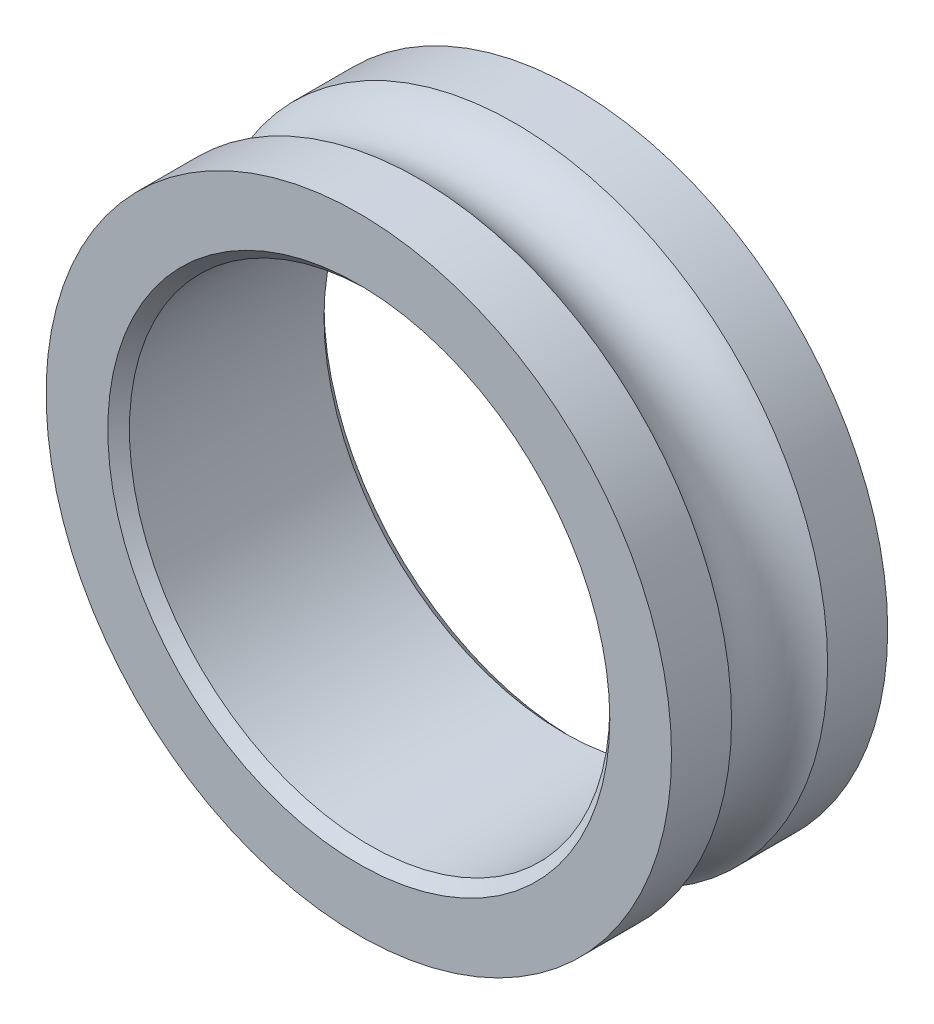
ISO-10303-21;
HEADER;
FILE_DESCRIPTION(('STEP AP214'),'2;1');
FILE_NAME('part.step','',(''),(''),'','','');
FILE_SCHEMA(('AUTOMOTIVE_DESIGN { 1 0 10303 214 1 1 1 1 }'));
ENDSEC;
DATA;
#1=APPLICATION_CONTEXT('core data for automotive mechanical design processes');
#2=APPLICATION_PROTOCOL_DEFINITION('international standard','automotive_design',2000,#1);
#3=PRODUCT_CONTEXT('',#1,'mechanical');
#4=PRODUCT('Part','Part','',(#3));
#5=PRODUCT_RELATED_PRODUCT_CATEGORY('part','',(#4));
#6=PRODUCT_DEFINITION_FORMATION('','',#4);
#7=PRODUCT_DEFINITION_CONTEXT('part definition',#1,'design');
#8=PRODUCT_DEFINITION('design','',#6,#7);
#9=PRODUCT_DEFINITION_SHAPE('','',#8);
#10=(LENGTH_UNIT() NAMED_UNIT(*) SI_UNIT(.MILLI.,.METRE.));
#11=(NAMED_UNIT(*) PLANE_ANGLE_UNIT() SI_UNIT($,.RADIAN.));
#12=(NAMED_UNIT(*) SI_UNIT($,.STERADIAN.) SOLID_ANGLE_UNIT());
#13=UNCERTAINTY_MEASURE_WITH_UNIT(LENGTH_MEASURE(1.E-05),#10,'distance_accuracy_value','');
#14=(GEOMETRIC_REPRESENTATION_CONTEXT(3) GLOBAL_UNCERTAINTY_ASSIGNED_CONTEXT((#13)) GLOBAL_UNIT_ASSIGNED_CONTEXT((#10,
#11,#12)) REPRESENTATION_CONTEXT('',''));
#15=CARTESIAN_POINT('',(0.,0.,0.));
#16=DIRECTION('',(0.,0.,1.));
#17=DIRECTION('',(1.,0.,0.));
#18=AXIS2_PLACEMENT_3D('',#15,#16,#17);
#19=CARTESIAN_POINT('',(0.,10.45,-4.5));
#20=DIRECTION('',(0.,0.,1.));
#21=DIRECTION('',(1.,0.,0.));
#22=AXIS2_PLACEMENT_3D('',#19,#20,#21);
#23=PLANE('',#22);
#24=CARTESIAN_POINT('',(0.,0.,-4.5));
#25=DIRECTION('',(0.,0.,1.));
#26=DIRECTION('',(-1.,0.,0.));
#27=AXIS2_PLACEMENT_3D('',#24,#25,#26);
#28=CIRCLE('',#27,10.45);
#29=CARTESIAN_POINT('',(-10.45,0.,-4.5));
#30=VERTEX_POINT('',#29);
#31=EDGE_CURVE('E39',#30,#30,#28,.T.);
#32=ORIENTED_EDGE('',*,*,#31,.T.);
#33=EDGE_LOOP('',(#32));
#34=FACE_BOUND('',#33,.T.);
#35=CARTESIAN_POINT('',(0.,0.,-4.5));
#36=DIRECTION('',(0.,0.,1.));
#37=DIRECTION('',(1.,0.,0.));
#38=AXIS2_PLACEMENT_3D('',#35,#36,#37);
#39=CIRCLE('',#38,13.0192307692308);
#40=CARTESIAN_POINT('',(13.0192307692308,0.,-4.5));
#41=VERTEX_POINT('',#40);
#42=EDGE_CURVE('E23',#41,#41,#39,.T.);
#43=ORIENTED_EDGE('',*,*,#42,.F.);
#44=EDGE_LOOP('',(#43));
#45=FACE_BOUND('',#44,.T.);
#46=ADVANCED_FACE('F15',(#34,#45),#23,.F.);
#47=CARTESIAN_POINT('',(0.,13.0192307692308,4.5));
#48=DIRECTION('',(0.,0.,-1.));
#49=DIRECTION('',(0.,-1.,0.));
#50=AXIS2_PLACEMENT_3D('',#47,#48,#49);
#51=PLANE('',#50);
#52=CARTESIAN_POINT('',(0.,0.,4.5));
#53=DIRECTION('',(0.,0.,-1.));
#54=DIRECTION('',(1.,0.,0.));
#55=AXIS2_PLACEMENT_3D('',#52,#53,#54);
#56=CIRCLE('',#55,10.45);
#57=CARTESIAN_POINT('',(10.45,0.,4.5));
#58=VERTEX_POINT('',#57);
#59=EDGE_CURVE('E32',#58,#58,#56,.T.);
#60=ORIENTED_EDGE('',*,*,#59,.T.);
#61=EDGE_LOOP('',(#60));
#62=FACE_BOUND('',#61,.T.);
#63=CARTESIAN_POINT('',(0.,0.,4.5));
#64=DIRECTION('',(0.,0.,-1.));
#65=DIRECTION('',(1.,0.,0.));
#66=AXIS2_PLACEMENT_3D('',#63,#64,#65);
#67=CIRCLE('',#66,13.0192307692308);
#68=CARTESIAN_POINT('',(13.0192307692308,0.,4.5));
#69=VERTEX_POINT('',#68);
#70=EDGE_CURVE('E10',#69,#69,#67,.T.);
#71=ORIENTED_EDGE('',*,*,#70,.F.);
#72=EDGE_LOOP('',(#71));
#73=FACE_BOUND('',#72,.T.);
#74=ADVANCED_FACE('F83',(#62,#73),#51,.F.);
#75=CARTESIAN_POINT('',(0.,0.,4.5));
#76=DIRECTION('',(0.,0.,1.));
#77=DIRECTION('',(1.,0.,0.));
#78=AXIS2_PLACEMENT_3D('',#75,#76,#77);
#79=CYLINDRICAL_SURFACE('',#78,13.0192307692308);
#80=ORIENTED_EDGE('',*,*,#70,.T.);
#81=EDGE_LOOP('',(#80));
#82=FACE_BOUND('',#81,.T.);
#83=CARTESIAN_POINT('',(0.,0.,2.));
#84=DIRECTION('',(0.,0.,1.));
#85=DIRECTION('',(1.,0.,0.));
#86=AXIS2_PLACEMENT_3D('',#83,#84,#85);
#87=CIRCLE('',#86,13.0192307692308);
#88=CARTESIAN_POINT('',(13.0192307692308,0.,2.));
#89=VERTEX_POINT('',#88);
#90=EDGE_CURVE('E49',#89,#89,#87,.T.);
#91=ORIENTED_EDGE('',*,*,#90,.T.);
#92=EDGE_LOOP('',(#91));
#93=FACE_BOUND('',#92,.T.);
#94=ADVANCED_FACE('F17',(#82,#93),#79,.T.);
#95=CARTESIAN_POINT('',(0.,0.,4.5));
#96=DIRECTION('',(0.,0.,1.));
#97=DIRECTION('',(1.,0.,0.));
#98=AXIS2_PLACEMENT_3D('',#95,#96,#97);
#99=CYLINDRICAL_SURFACE('',#98,13.0192307692308);
#100=CARTESIAN_POINT('',(0.,0.,-2.));
#101=DIRECTION('',(0.,0.,-1.));
#102=DIRECTION('',(1.,0.,0.));
#103=AXIS2_PLACEMENT_3D('',#100,#101,#102);
#104=CIRCLE('',#103,13.0192307692308);
#105=CARTESIAN_POINT('',(13.0192307692308,0.,-2.));
#106=VERTEX_POINT('',#105);
#107=EDGE_CURVE('E53',#106,#106,#104,.T.);
#108=ORIENTED_EDGE('',*,*,#107,.T.);
#109=EDGE_LOOP('',(#108));
#110=FACE_BOUND('',#109,.T.);
#111=ORIENTED_EDGE('',*,*,#42,.T.);
#112=EDGE_LOOP('',(#111));
#113=FACE_BOUND('',#112,.T.);
#114=ADVANCED_FACE('F92',(#110,#113),#99,.T.);
#115=CARTESIAN_POINT('',(0.,0.,4.5));
#116=DIRECTION('',(0.,0.,1.));
#117=DIRECTION('',(1.,0.,0.));
#118=AXIS2_PLACEMENT_3D('',#115,#116,#117);
#119=CONICAL_SURFACE('',#118,10.45,0.785398163397453);
#120=ORIENTED_EDGE('',*,*,#59,.F.);
#121=EDGE_LOOP('',(#120));
#122=FACE_BOUND('',#121,.T.);
#123=CARTESIAN_POINT('',(0.,0.,4.05));
#124=DIRECTION('',(0.,0.,-1.));
#125=DIRECTION('',(1.,0.,0.));
#126=AXIS2_PLACEMENT_3D('',#123,#124,#125);
#127=CIRCLE('',#126,10.);
#128=CARTESIAN_POINT('',(10.,0.,4.05));
#129=VERTEX_POINT('',#128);
#130=EDGE_CURVE('E44',#129,#129,#127,.T.);
#131=ORIENTED_EDGE('',*,*,#130,.T.);
#132=EDGE_LOOP('',(#131));
#133=FACE_BOUND('',#132,.T.);
#134=ADVANCED_FACE('F78',(#122,#133),#119,.F.);
#135=CARTESIAN_POINT('',(0.,0.,-4.5));
#136=DIRECTION('',(0.,0.,-1.));
#137=DIRECTION('',(-1.,0.,0.));
#138=AXIS2_PLACEMENT_3D('',#135,#136,#137);
#139=CONICAL_SURFACE('',#138,10.45,0.785398163397448);
#140=ORIENTED_EDGE('',*,*,#31,.F.);
#141=EDGE_LOOP('',(#140));
#142=FACE_BOUND('',#141,.T.);
#143=CARTESIAN_POINT('',(0.,0.,-4.05));
#144=DIRECTION('',(0.,0.,1.));
#145=DIRECTION('',(1.,0.,0.));
#146=AXIS2_PLACEMENT_3D('',#143,#144,#145);
#147=CIRCLE('',#146,10.);
#148=CARTESIAN_POINT('',(10.,0.,-4.05));
#149=VERTEX_POINT('',#148);
#150=EDGE_CURVE('E47',#149,#149,#147,.T.);
#151=ORIENTED_EDGE('',*,*,#150,.T.);
#152=EDGE_LOOP('',(#151));
#153=FACE_BOUND('',#152,.T.);
#154=ADVANCED_FACE('F65',(#142,#153),#139,.F.);
#155=CARTESIAN_POINT('',(0.,0.,4.5));
#156=DIRECTION('',(0.,0.,1.));
#157=DIRECTION('',(1.,0.,0.));
#158=AXIS2_PLACEMENT_3D('',#155,#156,#157);
#159=CYLINDRICAL_SURFACE('',#158,10.);
#160=ORIENTED_EDGE('',*,*,#130,.F.);
#161=EDGE_LOOP('',(#160));
#162=FACE_BOUND('',#161,.T.);
#163=ORIENTED_EDGE('',*,*,#150,.F.);
#164=EDGE_LOOP('',(#163));
#165=FACE_BOUND('',#164,.T.);
#166=ADVANCED_FACE('F70',(#162,#165),#159,.F.);
#167=CARTESIAN_POINT('',(0.,0.,0.));
#168=DIRECTION('',(0.,0.,1.));
#169=DIRECTION('',(0.,-1.,0.));
#170=AXIS2_PLACEMENT_3D('',#167,#168,#169);
#171=TOROIDAL_SURFACE('',#170,14.25,2.34835961884211);
#172=ORIENTED_EDGE('',*,*,#90,.F.);
#173=EDGE_LOOP('',(#172));
#174=FACE_BOUND('',#173,.T.);
#175=ORIENTED_EDGE('',*,*,#107,.F.);
#176=EDGE_LOOP('',(#175));
#177=FACE_BOUND('',#176,.T.);
#178=ADVANCED_FACE('F66',(#174,#177),#171,.F.);
#179=CLOSED_SHELL('',(#46,#74,#94,#114,#134,#154,#166,#178));
#180=MANIFOLD_SOLID_BREP('B1',#179);
#181=ADVANCED_BREP_SHAPE_REPRESENTATION('',(#18,#180),#14);
#182=SHAPE_DEFINITION_REPRESENTATION(#9,#181);
ENDSEC;
END-ISO-10303-21;
